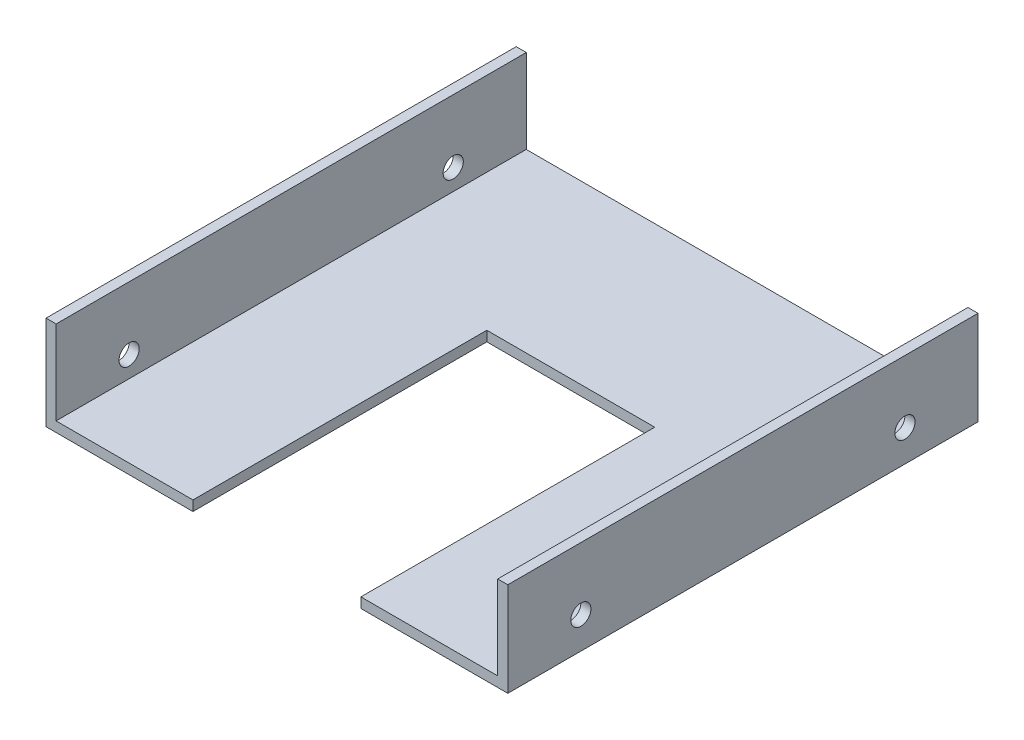
ISO-10303-21;
HEADER;
FILE_DESCRIPTION(('STEP AP214'),'2;1');
FILE_NAME('part.step','',(''),(''),'','','');
FILE_SCHEMA(('AUTOMOTIVE_DESIGN { 1 0 10303 214 1 1 1 1 }'));
ENDSEC;
DATA;
#1=APPLICATION_CONTEXT('core data for automotive mechanical design processes');
#2=APPLICATION_PROTOCOL_DEFINITION('international standard','automotive_design',2000,#1);
#3=PRODUCT_CONTEXT('',#1,'mechanical');
#4=PRODUCT('Part','Part','',(#3));
#5=PRODUCT_RELATED_PRODUCT_CATEGORY('part','',(#4));
#6=PRODUCT_DEFINITION_FORMATION('','',#4);
#7=PRODUCT_DEFINITION_CONTEXT('part definition',#1,'design');
#8=PRODUCT_DEFINITION('design','',#6,#7);
#9=PRODUCT_DEFINITION_SHAPE('','',#8);
#10=(LENGTH_UNIT() NAMED_UNIT(*) SI_UNIT(.MILLI.,.METRE.));
#11=(NAMED_UNIT(*) PLANE_ANGLE_UNIT() SI_UNIT($,.RADIAN.));
#12=(NAMED_UNIT(*) SI_UNIT($,.STERADIAN.) SOLID_ANGLE_UNIT());
#13=UNCERTAINTY_MEASURE_WITH_UNIT(LENGTH_MEASURE(1.E-05),#10,'distance_accuracy_value','');
#14=(GEOMETRIC_REPRESENTATION_CONTEXT(3) GLOBAL_UNCERTAINTY_ASSIGNED_CONTEXT((#13)) GLOBAL_UNIT_ASSIGNED_CONTEXT((#10,
#11,#12)) REPRESENTATION_CONTEXT('',''));
#15=CARTESIAN_POINT('',(0.,0.,0.));
#16=DIRECTION('',(0.,0.,1.));
#17=DIRECTION('',(1.,0.,0.));
#18=AXIS2_PLACEMENT_3D('',#15,#16,#17);
#19=CARTESIAN_POINT('',(0.,6.,0.));
#20=DIRECTION('',(0.,1.,0.));
#21=DIRECTION('',(0.,0.,1.));
#22=AXIS2_PLACEMENT_3D('',#19,#20,#21);
#23=PLANE('',#22);
#24=DIRECTION('',(1.,0.,0.));
#25=VECTOR('',#24,1.);
#26=CARTESIAN_POINT('',(0.,6.,238.130630630631));
#27=LINE('',#26,#25);
#28=CARTESIAN_POINT('',(91.9828028484065,6.,238.130630630631));
#29=VERTEX_POINT('',#28);
#30=CARTESIAN_POINT('',(173.482802848406,6.,238.130630630631));
#31=VERTEX_POINT('',#30);
#32=EDGE_CURVE('E191',#29,#31,#27,.T.);
#33=ORIENTED_EDGE('',*,*,#32,.T.);
#34=DIRECTION('',(0.,0.,1.));
#35=VECTOR('',#34,1.);
#36=CARTESIAN_POINT('',(173.482802848406,6.,39.3635376401868));
#37=LINE('',#36,#35);
#38=CARTESIAN_POINT('',(173.482802848406,6.,-41.8693693693694));
#39=VERTEX_POINT('',#38);
#40=EDGE_CURVE('E145',#39,#31,#37,.T.);
#41=ORIENTED_EDGE('',*,*,#40,.F.);
#42=DIRECTION('',(1.,0.,0.));
#43=VECTOR('',#42,1.);
#44=CARTESIAN_POINT('',(0.,6.,-41.8693693693694));
#45=LINE('',#44,#43);
#46=CARTESIAN_POINT('',(-89.5171971515935,6.,-41.8693693693694));
#47=VERTEX_POINT('',#46);
#48=EDGE_CURVE('E193',#47,#39,#45,.T.);
#49=ORIENTED_EDGE('',*,*,#48,.F.);
#50=DIRECTION('',(0.,0.,-1.));
#51=VECTOR('',#50,1.);
#52=CARTESIAN_POINT('',(-89.5171971515935,6.,17.1062333182245));
#53=LINE('',#52,#51);
#54=CARTESIAN_POINT('',(-89.5171971515935,6.,238.130630630631));
#55=VERTEX_POINT('',#54);
#56=EDGE_CURVE('E52',#55,#47,#53,.T.);
#57=ORIENTED_EDGE('',*,*,#56,.F.);
#58=CARTESIAN_POINT('',(-8.01719715159355,6.,238.130630630631));
#59=VERTEX_POINT('',#58);
#60=EDGE_CURVE('E194',#55,#59,#27,.T.);
#61=ORIENTED_EDGE('',*,*,#60,.T.);
#62=DIRECTION('',(0.,0.,-1.));
#63=VECTOR('',#62,1.);
#64=CARTESIAN_POINT('',(-8.01719715159355,6.,0.));
#65=LINE('',#64,#63);
#66=CARTESIAN_POINT('',(-8.01719715159355,6.,63.1306306306307));
#67=VERTEX_POINT('',#66);
#68=EDGE_CURVE('E59',#59,#67,#65,.T.);
#69=ORIENTED_EDGE('',*,*,#68,.T.);
#70=DIRECTION('',(1.,0.,0.));
#71=VECTOR('',#70,1.);
#72=CARTESIAN_POINT('',(0.,6.,63.1306306306307));
#73=LINE('',#72,#71);
#74=CARTESIAN_POINT('',(91.9828028484065,6.,63.1306306306307));
#75=VERTEX_POINT('',#74);
#76=EDGE_CURVE('E188',#67,#75,#73,.T.);
#77=ORIENTED_EDGE('',*,*,#76,.T.);
#78=DIRECTION('',(0.,0.,1.));
#79=VECTOR('',#78,1.);
#80=CARTESIAN_POINT('',(91.9828028484065,6.,0.));
#81=LINE('',#80,#79);
#82=EDGE_CURVE('E99',#75,#29,#81,.T.);
#83=ORIENTED_EDGE('',*,*,#82,.T.);
#84=EDGE_LOOP('',(#33,#41,#49,#57,#61,#69,#77,#83));
#85=FACE_BOUND('',#84,.T.);
#86=ADVANCED_FACE('F37',(#85),#23,.T.);
#87=CARTESIAN_POINT('',(0.,6.,63.1306306306307));
#88=DIRECTION('',(0.,0.,-1.));
#89=DIRECTION('',(-1.,0.,0.));
#90=AXIS2_PLACEMENT_3D('',#87,#88,#89);
#91=PLANE('',#90);
#92=DIRECTION('',(1.,0.,0.));
#93=VECTOR('',#92,1.);
#94=CARTESIAN_POINT('',(0.,0.,63.1306306306307));
#95=LINE('',#94,#93);
#96=CARTESIAN_POINT('',(-8.01719715159355,0.,63.1306306306307));
#97=VERTEX_POINT('',#96);
#98=CARTESIAN_POINT('',(91.9828028484065,0.,63.1306306306307));
#99=VERTEX_POINT('',#98);
#100=EDGE_CURVE('E187',#97,#99,#95,.T.);
#101=ORIENTED_EDGE('',*,*,#100,.T.);
#102=DIRECTION('',(0.,-1.,0.));
#103=VECTOR('',#102,1.);
#104=CARTESIAN_POINT('',(91.9828028484065,6.,63.1306306306307));
#105=LINE('',#104,#103);
#106=EDGE_CURVE('E11',#75,#99,#105,.T.);
#107=ORIENTED_EDGE('',*,*,#106,.F.);
#108=ORIENTED_EDGE('',*,*,#76,.F.);
#109=DIRECTION('',(0.,-1.,0.));
#110=VECTOR('',#109,1.);
#111=CARTESIAN_POINT('',(-8.01719715159355,6.,63.1306306306307));
#112=LINE('',#111,#110);
#113=EDGE_CURVE('E198',#67,#97,#112,.T.);
#114=ORIENTED_EDGE('',*,*,#113,.T.);
#115=EDGE_LOOP('',(#101,#107,#108,#114));
#116=FACE_BOUND('',#115,.T.);
#117=ADVANCED_FACE('F39',(#116),#91,.F.);
#118=CARTESIAN_POINT('',(91.9828028484065,6.,0.));
#119=DIRECTION('',(1.,0.,0.));
#120=DIRECTION('',(0.,0.,-1.));
#121=AXIS2_PLACEMENT_3D('',#118,#119,#120);
#122=PLANE('',#121);
#123=DIRECTION('',(0.,0.,1.));
#124=VECTOR('',#123,1.);
#125=CARTESIAN_POINT('',(91.9828028484065,0.,0.));
#126=LINE('',#125,#124);
#127=CARTESIAN_POINT('',(91.9828028484065,0.,238.130630630631));
#128=VERTEX_POINT('',#127);
#129=EDGE_CURVE('E201',#99,#128,#126,.T.);
#130=ORIENTED_EDGE('',*,*,#129,.T.);
#131=DIRECTION('',(0.,-1.,0.));
#132=VECTOR('',#131,1.);
#133=CARTESIAN_POINT('',(91.9828028484065,6.,238.130630630631));
#134=LINE('',#133,#132);
#135=EDGE_CURVE('E45',#29,#128,#134,.T.);
#136=ORIENTED_EDGE('',*,*,#135,.F.);
#137=ORIENTED_EDGE('',*,*,#82,.F.);
#138=ORIENTED_EDGE('',*,*,#106,.T.);
#139=EDGE_LOOP('',(#130,#136,#137,#138));
#140=FACE_BOUND('',#139,.T.);
#141=ADVANCED_FACE('F240',(#140),#122,.F.);
#142=CARTESIAN_POINT('',(0.,6.,238.130630630631));
#143=DIRECTION('',(0.,0.,-1.));
#144=DIRECTION('',(-1.,0.,0.));
#145=AXIS2_PLACEMENT_3D('',#142,#143,#144);
#146=PLANE('',#145);
#147=DIRECTION('',(1.,0.,0.));
#148=VECTOR('',#147,1.);
#149=CARTESIAN_POINT('',(0.,0.,238.130630630631));
#150=LINE('',#149,#148);
#151=CARTESIAN_POINT('',(179.482802848407,0.,238.130630630631));
#152=VERTEX_POINT('',#151);
#153=EDGE_CURVE('E203',#128,#152,#150,.T.);
#154=ORIENTED_EDGE('',*,*,#153,.T.);
#155=DIRECTION('',(0.,-1.,0.));
#156=VECTOR('',#155,1.);
#157=CARTESIAN_POINT('',(179.482802848407,6.,238.130630630631));
#158=LINE('',#157,#156);
#159=CARTESIAN_POINT('',(179.482802848407,56.,238.130630630631));
#160=VERTEX_POINT('',#159);
#161=EDGE_CURVE('E158',#160,#152,#158,.T.);
#162=ORIENTED_EDGE('',*,*,#161,.F.);
#163=DIRECTION('',(1.,0.,0.));
#164=VECTOR('',#163,1.);
#165=CARTESIAN_POINT('',(173.482802848406,56.,238.130630630631));
#166=LINE('',#165,#164);
#167=CARTESIAN_POINT('',(173.482802848406,56.,238.130630630631));
#168=VERTEX_POINT('',#167);
#169=EDGE_CURVE('E139',#168,#160,#166,.T.);
#170=ORIENTED_EDGE('',*,*,#169,.F.);
#171=DIRECTION('',(0.,-1.,0.));
#172=VECTOR('',#171,1.);
#173=CARTESIAN_POINT('',(173.482802848406,56.,238.130630630631));
#174=LINE('',#173,#172);
#175=EDGE_CURVE('E148',#168,#31,#174,.T.);
#176=ORIENTED_EDGE('',*,*,#175,.T.);
#177=ORIENTED_EDGE('',*,*,#32,.F.);
#178=ORIENTED_EDGE('',*,*,#135,.T.);
#179=EDGE_LOOP('',(#154,#162,#170,#176,#177,#178));
#180=FACE_BOUND('',#179,.T.);
#181=ADVANCED_FACE('F157',(#180),#146,.F.);
#182=CARTESIAN_POINT('',(179.482802848406,6.,0.));
#183=DIRECTION('',(1.,0.,0.));
#184=DIRECTION('',(0.,0.,-1.));
#185=AXIS2_PLACEMENT_3D('',#182,#183,#184);
#186=PLANE('',#185);
#187=CARTESIAN_POINT('',(179.482802848406,18.82824140705,194.630630630631));
#188=DIRECTION('',(1.,0.,0.));
#189=DIRECTION('',(0.,0.,-1.));
#190=AXIS2_PLACEMENT_3D('',#187,#188,#189);
#191=CIRCLE('',#190,6.00000000000002);
#192=CARTESIAN_POINT('',(179.482802848406,18.82824140705,188.630630630631));
#193=VERTEX_POINT('',#192);
#194=EDGE_CURVE('E278',#193,#193,#191,.T.);
#195=ORIENTED_EDGE('',*,*,#194,.F.);
#196=EDGE_LOOP('',(#195));
#197=FACE_BOUND('',#196,.T.);
#198=CARTESIAN_POINT('',(179.482802848406,18.82824140705,1.63063063063063));
#199=DIRECTION('',(1.,0.,0.));
#200=DIRECTION('',(0.,0.,-1.));
#201=AXIS2_PLACEMENT_3D('',#198,#199,#200);
#202=CIRCLE('',#201,6.);
#203=CARTESIAN_POINT('',(179.482802848406,18.82824140705,-4.36936936936937));
#204=VERTEX_POINT('',#203);
#205=EDGE_CURVE('E281',#204,#204,#202,.T.);
#206=ORIENTED_EDGE('',*,*,#205,.F.);
#207=EDGE_LOOP('',(#206));
#208=FACE_BOUND('',#207,.T.);
#209=DIRECTION('',(0.,0.,1.));
#210=VECTOR('',#209,1.);
#211=CARTESIAN_POINT('',(179.482802848406,0.,0.));
#212=LINE('',#211,#210);
#213=CARTESIAN_POINT('',(179.482802848406,0.,-41.8693693693694));
#214=VERTEX_POINT('',#213);
#215=EDGE_CURVE('E205',#214,#152,#212,.T.);
#216=ORIENTED_EDGE('',*,*,#215,.F.);
#217=DIRECTION('',(0.,-1.,0.));
#218=VECTOR('',#217,1.);
#219=CARTESIAN_POINT('',(179.482802848406,6.,-41.8693693693694));
#220=LINE('',#219,#218);
#221=CARTESIAN_POINT('',(179.482802848406,56.,-41.8693693693694));
#222=VERTEX_POINT('',#221);
#223=EDGE_CURVE('E223',#222,#214,#220,.T.);
#224=ORIENTED_EDGE('',*,*,#223,.F.);
#225=DIRECTION('',(0.,0.,-1.));
#226=VECTOR('',#225,1.);
#227=CARTESIAN_POINT('',(179.482802848407,56.,238.130630630631));
#228=LINE('',#227,#226);
#229=EDGE_CURVE('E159',#160,#222,#228,.T.);
#230=ORIENTED_EDGE('',*,*,#229,.F.);
#231=ORIENTED_EDGE('',*,*,#161,.T.);
#232=EDGE_LOOP('',(#216,#224,#230,#231));
#233=FACE_BOUND('',#232,.T.);
#234=ADVANCED_FACE('F234',(#197,#208,#233),#186,.T.);
#235=CARTESIAN_POINT('',(0.,6.,-41.8693693693694));
#236=DIRECTION('',(0.,0.,-1.));
#237=DIRECTION('',(-1.,0.,0.));
#238=AXIS2_PLACEMENT_3D('',#235,#236,#237);
#239=PLANE('',#238);
#240=DIRECTION('',(1.,0.,0.));
#241=VECTOR('',#240,1.);
#242=CARTESIAN_POINT('',(0.,0.,-41.8693693693694));
#243=LINE('',#242,#241);
#244=CARTESIAN_POINT('',(-95.5171971515935,0.,-41.8693693693694));
#245=VERTEX_POINT('',#244);
#246=EDGE_CURVE('E209',#245,#214,#243,.T.);
#247=ORIENTED_EDGE('',*,*,#246,.F.);
#248=DIRECTION('',(0.,-1.,0.));
#249=VECTOR('',#248,1.);
#250=CARTESIAN_POINT('',(-95.5171971515935,6.,-41.8693693693694));
#251=LINE('',#250,#249);
#252=CARTESIAN_POINT('',(-95.5171971515935,56.,-41.8693693693694));
#253=VERTEX_POINT('',#252);
#254=EDGE_CURVE('E221',#253,#245,#251,.T.);
#255=ORIENTED_EDGE('',*,*,#254,.F.);
#256=DIRECTION('',(-1.,0.,0.));
#257=VECTOR('',#256,1.);
#258=CARTESIAN_POINT('',(-89.5171971515935,56.,-41.8693693693694));
#259=LINE('',#258,#257);
#260=CARTESIAN_POINT('',(-89.5171971515935,56.,-41.8693693693694));
#261=VERTEX_POINT('',#260);
#262=EDGE_CURVE('E171',#261,#253,#259,.T.);
#263=ORIENTED_EDGE('',*,*,#262,.F.);
#264=DIRECTION('',(0.,-1.,0.));
#265=VECTOR('',#264,1.);
#266=CARTESIAN_POINT('',(-89.5171971515935,56.,-41.8693693693694));
#267=LINE('',#266,#265);
#268=EDGE_CURVE('E184',#261,#47,#267,.T.);
#269=ORIENTED_EDGE('',*,*,#268,.T.);
#270=ORIENTED_EDGE('',*,*,#48,.T.);
#271=DIRECTION('',(0.,-1.,0.));
#272=VECTOR('',#271,1.);
#273=CARTESIAN_POINT('',(173.482802848406,56.,-41.8693693693694));
#274=LINE('',#273,#272);
#275=CARTESIAN_POINT('',(173.482802848406,56.,-41.8693693693694));
#276=VERTEX_POINT('',#275);
#277=EDGE_CURVE('E154',#276,#39,#274,.T.);
#278=ORIENTED_EDGE('',*,*,#277,.F.);
#279=DIRECTION('',(-1.,0.,0.));
#280=VECTOR('',#279,1.);
#281=CARTESIAN_POINT('',(179.482802848406,56.,-41.8693693693694));
#282=LINE('',#281,#280);
#283=EDGE_CURVE('E142',#222,#276,#282,.T.);
#284=ORIENTED_EDGE('',*,*,#283,.F.);
#285=ORIENTED_EDGE('',*,*,#223,.T.);
#286=EDGE_LOOP('',(#247,#255,#263,#269,#270,#278,#284,#285));
#287=FACE_BOUND('',#286,.T.);
#288=ADVANCED_FACE('F236',(#287),#239,.T.);
#289=CARTESIAN_POINT('',(-95.5171971515935,6.,0.));
#290=DIRECTION('',(1.,0.,0.));
#291=DIRECTION('',(0.,0.,-1.));
#292=AXIS2_PLACEMENT_3D('',#289,#290,#291);
#293=PLANE('',#292);
#294=CARTESIAN_POINT('',(-95.5171971515935,18.5,1.63063063063063));
#295=DIRECTION('',(-1.,0.,0.));
#296=DIRECTION('',(0.,0.,1.));
#297=AXIS2_PLACEMENT_3D('',#294,#295,#296);
#298=CIRCLE('',#297,6.);
#299=CARTESIAN_POINT('',(-95.5171971515935,18.5,7.63063063063063));
#300=VERTEX_POINT('',#299);
#301=EDGE_CURVE('E297',#300,#300,#298,.T.);
#302=ORIENTED_EDGE('',*,*,#301,.F.);
#303=EDGE_LOOP('',(#302));
#304=FACE_BOUND('',#303,.T.);
#305=CARTESIAN_POINT('',(-95.5171971515935,18.5,194.630630630631));
#306=DIRECTION('',(-1.,0.,0.));
#307=DIRECTION('',(0.,0.,1.));
#308=AXIS2_PLACEMENT_3D('',#305,#306,#307);
#309=CIRCLE('',#308,6.00000000000002);
#310=CARTESIAN_POINT('',(-95.5171971515935,18.5,200.630630630631));
#311=VERTEX_POINT('',#310);
#312=EDGE_CURVE('E294',#311,#311,#309,.T.);
#313=ORIENTED_EDGE('',*,*,#312,.F.);
#314=EDGE_LOOP('',(#313));
#315=FACE_BOUND('',#314,.T.);
#316=DIRECTION('',(0.,0.,1.));
#317=VECTOR('',#316,1.);
#318=CARTESIAN_POINT('',(-95.5171971515935,0.,0.));
#319=LINE('',#318,#317);
#320=CARTESIAN_POINT('',(-95.5171971515935,0.,238.130630630631));
#321=VERTEX_POINT('',#320);
#322=EDGE_CURVE('E212',#245,#321,#319,.T.);
#323=ORIENTED_EDGE('',*,*,#322,.T.);
#324=DIRECTION('',(0.,-1.,0.));
#325=VECTOR('',#324,1.);
#326=CARTESIAN_POINT('',(-95.5171971515935,6.,238.130630630631));
#327=LINE('',#326,#325);
#328=CARTESIAN_POINT('',(-95.5171971515935,56.,238.130630630631));
#329=VERTEX_POINT('',#328);
#330=EDGE_CURVE('E218',#329,#321,#327,.T.);
#331=ORIENTED_EDGE('',*,*,#330,.F.);
#332=DIRECTION('',(0.,0.,1.));
#333=VECTOR('',#332,1.);
#334=CARTESIAN_POINT('',(-95.5171971515935,56.,-41.8693693693694));
#335=LINE('',#334,#333);
#336=EDGE_CURVE('E174',#253,#329,#335,.T.);
#337=ORIENTED_EDGE('',*,*,#336,.F.);
#338=ORIENTED_EDGE('',*,*,#254,.T.);
#339=EDGE_LOOP('',(#323,#331,#337,#338));
#340=FACE_BOUND('',#339,.T.);
#341=ADVANCED_FACE('F263',(#304,#315,#340),#293,.F.);
#342=CARTESIAN_POINT('',(-8.01719715159355,0.,238.130630630631));
#343=VERTEX_POINT('',#342);
#344=EDGE_CURVE('E206',#321,#343,#150,.T.);
#345=ORIENTED_EDGE('',*,*,#344,.T.);
#346=DIRECTION('',(0.,-1.,0.));
#347=VECTOR('',#346,1.);
#348=CARTESIAN_POINT('',(-8.01719715159355,6.,238.130630630631));
#349=LINE('',#348,#347);
#350=EDGE_CURVE('E216',#59,#343,#349,.T.);
#351=ORIENTED_EDGE('',*,*,#350,.F.);
#352=ORIENTED_EDGE('',*,*,#60,.F.);
#353=DIRECTION('',(0.,-1.,0.));
#354=VECTOR('',#353,1.);
#355=CARTESIAN_POINT('',(-89.5171971515935,56.,238.130630630631));
#356=LINE('',#355,#354);
#357=CARTESIAN_POINT('',(-89.5171971515935,56.,238.130630630631));
#358=VERTEX_POINT('',#357);
#359=EDGE_CURVE('E180',#358,#55,#356,.T.);
#360=ORIENTED_EDGE('',*,*,#359,.F.);
#361=DIRECTION('',(1.,0.,0.));
#362=VECTOR('',#361,1.);
#363=CARTESIAN_POINT('',(-95.5171971515935,56.,238.130630630631));
#364=LINE('',#363,#362);
#365=EDGE_CURVE('E177',#329,#358,#364,.T.);
#366=ORIENTED_EDGE('',*,*,#365,.F.);
#367=ORIENTED_EDGE('',*,*,#330,.T.);
#368=EDGE_LOOP('',(#345,#351,#352,#360,#366,#367));
#369=FACE_BOUND('',#368,.T.);
#370=ADVANCED_FACE('F247',(#369),#146,.F.);
#371=CARTESIAN_POINT('',(-8.01719715159355,6.,0.));
#372=DIRECTION('',(-1.,0.,0.));
#373=DIRECTION('',(0.,0.,1.));
#374=AXIS2_PLACEMENT_3D('',#371,#372,#373);
#375=PLANE('',#374);
#376=DIRECTION('',(0.,0.,-1.));
#377=VECTOR('',#376,1.);
#378=CARTESIAN_POINT('',(-8.01719715159355,0.,0.));
#379=LINE('',#378,#377);
#380=EDGE_CURVE('E92',#343,#97,#379,.T.);
#381=ORIENTED_EDGE('',*,*,#380,.T.);
#382=ORIENTED_EDGE('',*,*,#113,.F.);
#383=ORIENTED_EDGE('',*,*,#68,.F.);
#384=ORIENTED_EDGE('',*,*,#350,.T.);
#385=EDGE_LOOP('',(#381,#382,#383,#384));
#386=FACE_BOUND('',#385,.T.);
#387=ADVANCED_FACE('F259',(#386),#375,.F.);
#388=CARTESIAN_POINT('',(0.,0.,0.));
#389=DIRECTION('',(0.,1.,0.));
#390=DIRECTION('',(0.,0.,1.));
#391=AXIS2_PLACEMENT_3D('',#388,#389,#390);
#392=PLANE('',#391);
#393=ORIENTED_EDGE('',*,*,#100,.F.);
#394=ORIENTED_EDGE('',*,*,#380,.F.);
#395=ORIENTED_EDGE('',*,*,#344,.F.);
#396=ORIENTED_EDGE('',*,*,#322,.F.);
#397=ORIENTED_EDGE('',*,*,#246,.T.);
#398=ORIENTED_EDGE('',*,*,#215,.T.);
#399=ORIENTED_EDGE('',*,*,#153,.F.);
#400=ORIENTED_EDGE('',*,*,#129,.F.);
#401=EDGE_LOOP('',(#393,#394,#395,#396,#397,#398,#399,#400));
#402=FACE_BOUND('',#401,.T.);
#403=ADVANCED_FACE('F229',(#402),#392,.F.);
#404=CARTESIAN_POINT('',(-89.5171971515935,56.,17.1062333182245));
#405=DIRECTION('',(-1.,0.,0.));
#406=DIRECTION('',(0.,0.,1.));
#407=AXIS2_PLACEMENT_3D('',#404,#405,#406);
#408=PLANE('',#407);
#409=CARTESIAN_POINT('',(-89.5171971515935,18.5,1.63063063063063));
#410=DIRECTION('',(-1.,0.,0.));
#411=DIRECTION('',(0.,0.,1.));
#412=AXIS2_PLACEMENT_3D('',#409,#410,#411);
#413=CIRCLE('',#412,6.);
#414=CARTESIAN_POINT('',(-89.5171971515935,18.5,7.63063063063063));
#415=VERTEX_POINT('',#414);
#416=EDGE_CURVE('E287',#415,#415,#413,.T.);
#417=ORIENTED_EDGE('',*,*,#416,.T.);
#418=EDGE_LOOP('',(#417));
#419=FACE_BOUND('',#418,.T.);
#420=CARTESIAN_POINT('',(-89.5171971515935,18.5,194.630630630631));
#421=DIRECTION('',(-1.,0.,0.));
#422=DIRECTION('',(0.,0.,1.));
#423=AXIS2_PLACEMENT_3D('',#420,#421,#422);
#424=CIRCLE('',#423,6.00000000000002);
#425=CARTESIAN_POINT('',(-89.5171971515935,18.5,200.630630630631));
#426=VERTEX_POINT('',#425);
#427=EDGE_CURVE('E291',#426,#426,#424,.T.);
#428=ORIENTED_EDGE('',*,*,#427,.T.);
#429=EDGE_LOOP('',(#428));
#430=FACE_BOUND('',#429,.T.);
#431=ORIENTED_EDGE('',*,*,#56,.T.);
#432=ORIENTED_EDGE('',*,*,#268,.F.);
#433=DIRECTION('',(0.,0.,-1.));
#434=VECTOR('',#433,1.);
#435=CARTESIAN_POINT('',(-89.5171971515935,56.,17.1062333182245));
#436=LINE('',#435,#434);
#437=EDGE_CURVE('E168',#358,#261,#436,.T.);
#438=ORIENTED_EDGE('',*,*,#437,.F.);
#439=ORIENTED_EDGE('',*,*,#359,.T.);
#440=EDGE_LOOP('',(#431,#432,#438,#439));
#441=FACE_BOUND('',#440,.T.);
#442=ADVANCED_FACE('F255',(#419,#430,#441),#408,.F.);
#443=CARTESIAN_POINT('',(0.,56.,0.));
#444=DIRECTION('',(0.,1.,0.));
#445=DIRECTION('',(0.,0.,1.));
#446=AXIS2_PLACEMENT_3D('',#443,#444,#445);
#447=PLANE('',#446);
#448=ORIENTED_EDGE('',*,*,#437,.T.);
#449=ORIENTED_EDGE('',*,*,#262,.T.);
#450=ORIENTED_EDGE('',*,*,#336,.T.);
#451=ORIENTED_EDGE('',*,*,#365,.T.);
#452=EDGE_LOOP('',(#448,#449,#450,#451));
#453=FACE_BOUND('',#452,.T.);
#454=ADVANCED_FACE('F320',(#453),#447,.T.);
#455=CARTESIAN_POINT('',(173.482802848406,56.,39.3635376401868));
#456=DIRECTION('',(1.,0.,0.));
#457=DIRECTION('',(0.,0.,-1.));
#458=AXIS2_PLACEMENT_3D('',#455,#456,#457);
#459=PLANE('',#458);
#460=CARTESIAN_POINT('',(173.482802848406,18.82824140705,194.630630630631));
#461=DIRECTION('',(1.,0.,0.));
#462=DIRECTION('',(0.,0.,-1.));
#463=AXIS2_PLACEMENT_3D('',#460,#461,#462);
#464=CIRCLE('',#463,6.00000000000002);
#465=CARTESIAN_POINT('',(173.482802848406,18.82824140705,188.630630630631));
#466=VERTEX_POINT('',#465);
#467=EDGE_CURVE('E166',#466,#466,#464,.T.);
#468=ORIENTED_EDGE('',*,*,#467,.T.);
#469=EDGE_LOOP('',(#468));
#470=FACE_BOUND('',#469,.T.);
#471=CARTESIAN_POINT('',(173.482802848406,18.82824140705,1.63063063063063));
#472=DIRECTION('',(1.,0.,0.));
#473=DIRECTION('',(0.,0.,-1.));
#474=AXIS2_PLACEMENT_3D('',#471,#472,#473);
#475=CIRCLE('',#474,6.);
#476=CARTESIAN_POINT('',(173.482802848406,18.82824140705,-4.36936936936937));
#477=VERTEX_POINT('',#476);
#478=EDGE_CURVE('E283',#477,#477,#475,.T.);
#479=ORIENTED_EDGE('',*,*,#478,.T.);
#480=EDGE_LOOP('',(#479));
#481=FACE_BOUND('',#480,.T.);
#482=ORIENTED_EDGE('',*,*,#40,.T.);
#483=ORIENTED_EDGE('',*,*,#175,.F.);
#484=DIRECTION('',(0.,0.,1.));
#485=VECTOR('',#484,1.);
#486=CARTESIAN_POINT('',(173.482802848406,56.,39.3635376401868));
#487=LINE('',#486,#485);
#488=EDGE_CURVE('E134',#276,#168,#487,.T.);
#489=ORIENTED_EDGE('',*,*,#488,.F.);
#490=ORIENTED_EDGE('',*,*,#277,.T.);
#491=EDGE_LOOP('',(#482,#483,#489,#490));
#492=FACE_BOUND('',#491,.T.);
#493=ADVANCED_FACE('F149',(#470,#481,#492),#459,.F.);
#494=CARTESIAN_POINT('',(0.,56.,0.));
#495=DIRECTION('',(0.,1.,0.));
#496=DIRECTION('',(0.,0.,1.));
#497=AXIS2_PLACEMENT_3D('',#494,#495,#496);
#498=PLANE('',#497);
#499=ORIENTED_EDGE('',*,*,#488,.T.);
#500=ORIENTED_EDGE('',*,*,#169,.T.);
#501=ORIENTED_EDGE('',*,*,#229,.T.);
#502=ORIENTED_EDGE('',*,*,#283,.T.);
#503=EDGE_LOOP('',(#499,#500,#501,#502));
#504=FACE_BOUND('',#503,.T.);
#505=ADVANCED_FACE('F136',(#504),#498,.T.);
#506=CARTESIAN_POINT('',(173.482802848406,18.82824140705,1.63063063063063));
#507=DIRECTION('',(1.,0.,0.));
#508=DIRECTION('',(0.,0.,-1.));
#509=AXIS2_PLACEMENT_3D('',#506,#507,#508);
#510=CYLINDRICAL_SURFACE('',#509,6.);
#511=ORIENTED_EDGE('',*,*,#478,.F.);
#512=EDGE_LOOP('',(#511));
#513=FACE_BOUND('',#512,.T.);
#514=ORIENTED_EDGE('',*,*,#205,.T.);
#515=EDGE_LOOP('',(#514));
#516=FACE_BOUND('',#515,.T.);
#517=ADVANCED_FACE('F336',(#513,#516),#510,.F.);
#518=CARTESIAN_POINT('',(173.482802848406,18.82824140705,194.630630630631));
#519=DIRECTION('',(1.,0.,0.));
#520=DIRECTION('',(0.,0.,-1.));
#521=AXIS2_PLACEMENT_3D('',#518,#519,#520);
#522=CYLINDRICAL_SURFACE('',#521,6.00000000000002);
#523=ORIENTED_EDGE('',*,*,#467,.F.);
#524=EDGE_LOOP('',(#523));
#525=FACE_BOUND('',#524,.T.);
#526=ORIENTED_EDGE('',*,*,#194,.T.);
#527=EDGE_LOOP('',(#526));
#528=FACE_BOUND('',#527,.T.);
#529=ADVANCED_FACE('F339',(#525,#528),#522,.F.);
#530=CARTESIAN_POINT('',(-89.5171971515935,18.5,194.630630630631));
#531=DIRECTION('',(-1.,0.,0.));
#532=DIRECTION('',(0.,0.,1.));
#533=AXIS2_PLACEMENT_3D('',#530,#531,#532);
#534=CYLINDRICAL_SURFACE('',#533,6.00000000000002);
#535=ORIENTED_EDGE('',*,*,#427,.F.);
#536=EDGE_LOOP('',(#535));
#537=FACE_BOUND('',#536,.T.);
#538=ORIENTED_EDGE('',*,*,#312,.T.);
#539=EDGE_LOOP('',(#538));
#540=FACE_BOUND('',#539,.T.);
#541=ADVANCED_FACE('F308',(#537,#540),#534,.F.);
#542=CARTESIAN_POINT('',(-89.5171971515935,18.5,1.63063063063063));
#543=DIRECTION('',(-1.,0.,0.));
#544=DIRECTION('',(0.,0.,1.));
#545=AXIS2_PLACEMENT_3D('',#542,#543,#544);
#546=CYLINDRICAL_SURFACE('',#545,6.);
#547=ORIENTED_EDGE('',*,*,#416,.F.);
#548=EDGE_LOOP('',(#547));
#549=FACE_BOUND('',#548,.T.);
#550=ORIENTED_EDGE('',*,*,#301,.T.);
#551=EDGE_LOOP('',(#550));
#552=FACE_BOUND('',#551,.T.);
#553=ADVANCED_FACE('F305',(#549,#552),#546,.F.);
#554=CLOSED_SHELL('',(#86,#117,#141,#181,#234,#288,#341,#370,#387,#403,#442,#454,#493,#505,#517,
#529,#541,#553));
#555=MANIFOLD_SOLID_BREP('B2',#554);
#556=ADVANCED_BREP_SHAPE_REPRESENTATION('',(#18,#555),#14);
#557=SHAPE_DEFINITION_REPRESENTATION(#9,#556);
ENDSEC;
END-ISO-10303-21;
